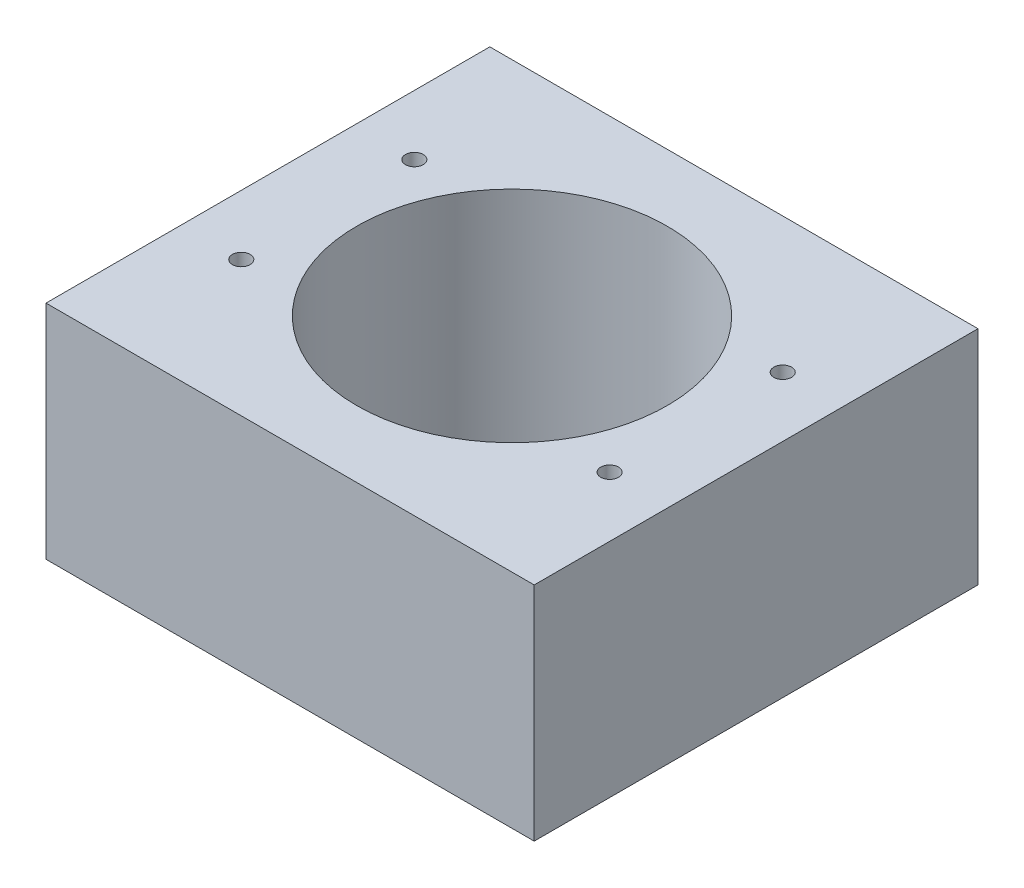
ISO-10303-21;
HEADER;
FILE_DESCRIPTION(('STEP AP214'),'2;1');
FILE_NAME('part.step','',(''),(''),'','','');
FILE_SCHEMA(('AUTOMOTIVE_DESIGN { 1 0 10303 214 1 1 1 1 }'));
ENDSEC;
DATA;
#1=APPLICATION_CONTEXT('core data for automotive mechanical design processes');
#2=APPLICATION_PROTOCOL_DEFINITION('international standard','automotive_design',2000,#1);
#3=PRODUCT_CONTEXT('',#1,'mechanical');
#4=PRODUCT('Part','Part','',(#3));
#5=PRODUCT_RELATED_PRODUCT_CATEGORY('part','',(#4));
#6=PRODUCT_DEFINITION_FORMATION('','',#4);
#7=PRODUCT_DEFINITION_CONTEXT('part definition',#1,'design');
#8=PRODUCT_DEFINITION('design','',#6,#7);
#9=PRODUCT_DEFINITION_SHAPE('','',#8);
#10=(LENGTH_UNIT() NAMED_UNIT(*) SI_UNIT(.MILLI.,.METRE.));
#11=(NAMED_UNIT(*) PLANE_ANGLE_UNIT() SI_UNIT($,.RADIAN.));
#12=(NAMED_UNIT(*) SI_UNIT($,.STERADIAN.) SOLID_ANGLE_UNIT());
#13=UNCERTAINTY_MEASURE_WITH_UNIT(LENGTH_MEASURE(1.E-05),#10,'distance_accuracy_value','');
#14=(GEOMETRIC_REPRESENTATION_CONTEXT(3) GLOBAL_UNCERTAINTY_ASSIGNED_CONTEXT((#13)) GLOBAL_UNIT_ASSIGNED_CONTEXT((#10,
#11,#12)) REPRESENTATION_CONTEXT('',''));
#15=CARTESIAN_POINT('',(0.,0.,0.));
#16=DIRECTION('',(0.,0.,1.));
#17=DIRECTION('',(1.,0.,0.));
#18=AXIS2_PLACEMENT_3D('',#15,#16,#17);
#19=CARTESIAN_POINT('',(55.,50.,-50.));
#20=DIRECTION('',(-1.,0.,0.));
#21=DIRECTION('',(0.,0.,1.));
#22=AXIS2_PLACEMENT_3D('',#19,#20,#21);
#23=PLANE('',#22);
#24=DIRECTION('',(0.,0.,-1.));
#25=VECTOR('',#24,1.);
#26=CARTESIAN_POINT('',(55.,0.,-50.));
#27=LINE('',#26,#25);
#28=CARTESIAN_POINT('',(55.,0.,50.));
#29=VERTEX_POINT('',#28);
#30=CARTESIAN_POINT('',(55.,0.,-50.));
#31=VERTEX_POINT('',#30);
#32=EDGE_CURVE('E96',#29,#31,#27,.T.);
#33=ORIENTED_EDGE('',*,*,#32,.T.);
#34=DIRECTION('',(0.,-1.,0.));
#35=VECTOR('',#34,1.);
#36=CARTESIAN_POINT('',(55.,50.,-50.));
#37=LINE('',#36,#35);
#38=CARTESIAN_POINT('',(55.,50.,-50.));
#39=VERTEX_POINT('',#38);
#40=EDGE_CURVE('E11',#39,#31,#37,.T.);
#41=ORIENTED_EDGE('',*,*,#40,.F.);
#42=DIRECTION('',(0.,0.,-1.));
#43=VECTOR('',#42,1.);
#44=CARTESIAN_POINT('',(55.,50.,-50.));
#45=LINE('',#44,#43);
#46=CARTESIAN_POINT('',(55.,50.,50.));
#47=VERTEX_POINT('',#46);
#48=EDGE_CURVE('E84',#47,#39,#45,.T.);
#49=ORIENTED_EDGE('',*,*,#48,.F.);
#50=DIRECTION('',(0.,-1.,0.));
#51=VECTOR('',#50,1.);
#52=CARTESIAN_POINT('',(55.,50.,50.));
#53=LINE('',#52,#51);
#54=EDGE_CURVE('E92',#47,#29,#53,.T.);
#55=ORIENTED_EDGE('',*,*,#54,.T.);
#56=EDGE_LOOP('',(#33,#41,#49,#55));
#57=FACE_BOUND('',#56,.T.);
#58=ADVANCED_FACE('F33',(#57),#23,.F.);
#59=CARTESIAN_POINT('',(-55.,50.,-50.));
#60=DIRECTION('',(0.,0.,1.));
#61=DIRECTION('',(1.,0.,0.));
#62=AXIS2_PLACEMENT_3D('',#59,#60,#61);
#63=PLANE('',#62);
#64=DIRECTION('',(-1.,0.,0.));
#65=VECTOR('',#64,1.);
#66=CARTESIAN_POINT('',(-55.,0.,-50.));
#67=LINE('',#66,#65);
#68=CARTESIAN_POINT('',(-55.,0.,-50.));
#69=VERTEX_POINT('',#68);
#70=EDGE_CURVE('E88',#31,#69,#67,.T.);
#71=ORIENTED_EDGE('',*,*,#70,.T.);
#72=DIRECTION('',(0.,-1.,0.));
#73=VECTOR('',#72,1.);
#74=CARTESIAN_POINT('',(-55.,50.,-50.));
#75=LINE('',#74,#73);
#76=CARTESIAN_POINT('',(-55.,50.,-50.));
#77=VERTEX_POINT('',#76);
#78=EDGE_CURVE('E41',#77,#69,#75,.T.);
#79=ORIENTED_EDGE('',*,*,#78,.F.);
#80=DIRECTION('',(-1.,0.,0.));
#81=VECTOR('',#80,1.);
#82=CARTESIAN_POINT('',(-55.,50.,-50.));
#83=LINE('',#82,#81);
#84=EDGE_CURVE('E79',#39,#77,#83,.T.);
#85=ORIENTED_EDGE('',*,*,#84,.F.);
#86=ORIENTED_EDGE('',*,*,#40,.T.);
#87=EDGE_LOOP('',(#71,#79,#85,#86));
#88=FACE_BOUND('',#87,.T.);
#89=ADVANCED_FACE('F87',(#88),#63,.F.);
#90=CARTESIAN_POINT('',(-55.,50.,-50.));
#91=DIRECTION('',(1.,0.,0.));
#92=DIRECTION('',(0.,0.,-1.));
#93=AXIS2_PLACEMENT_3D('',#90,#91,#92);
#94=PLANE('',#93);
#95=DIRECTION('',(0.,0.,1.));
#96=VECTOR('',#95,1.);
#97=CARTESIAN_POINT('',(-55.,0.,-50.));
#98=LINE('',#97,#96);
#99=CARTESIAN_POINT('',(-55.,0.,50.));
#100=VERTEX_POINT('',#99);
#101=EDGE_CURVE('E66',#69,#100,#98,.T.);
#102=ORIENTED_EDGE('',*,*,#101,.T.);
#103=DIRECTION('',(0.,-1.,0.));
#104=VECTOR('',#103,1.);
#105=CARTESIAN_POINT('',(-55.,50.,50.));
#106=LINE('',#105,#104);
#107=CARTESIAN_POINT('',(-55.,50.,50.));
#108=VERTEX_POINT('',#107);
#109=EDGE_CURVE('E89',#108,#100,#106,.T.);
#110=ORIENTED_EDGE('',*,*,#109,.F.);
#111=DIRECTION('',(0.,0.,1.));
#112=VECTOR('',#111,1.);
#113=CARTESIAN_POINT('',(-55.,50.,-50.));
#114=LINE('',#113,#112);
#115=EDGE_CURVE('E82',#77,#108,#114,.T.);
#116=ORIENTED_EDGE('',*,*,#115,.F.);
#117=ORIENTED_EDGE('',*,*,#78,.T.);
#118=EDGE_LOOP('',(#102,#110,#116,#117));
#119=FACE_BOUND('',#118,.T.);
#120=ADVANCED_FACE('F90',(#119),#94,.F.);
#121=CARTESIAN_POINT('',(-55.,50.,50.));
#122=DIRECTION('',(0.,0.,-1.));
#123=DIRECTION('',(-1.,0.,0.));
#124=AXIS2_PLACEMENT_3D('',#121,#122,#123);
#125=PLANE('',#124);
#126=DIRECTION('',(1.,0.,0.));
#127=VECTOR('',#126,1.);
#128=CARTESIAN_POINT('',(-55.,0.,50.));
#129=LINE('',#128,#127);
#130=EDGE_CURVE('E72',#100,#29,#129,.T.);
#131=ORIENTED_EDGE('',*,*,#130,.T.);
#132=ORIENTED_EDGE('',*,*,#54,.F.);
#133=DIRECTION('',(1.,0.,0.));
#134=VECTOR('',#133,1.);
#135=CARTESIAN_POINT('',(-55.,50.,50.));
#136=LINE('',#135,#134);
#137=EDGE_CURVE('E49',#108,#47,#136,.T.);
#138=ORIENTED_EDGE('',*,*,#137,.F.);
#139=ORIENTED_EDGE('',*,*,#109,.T.);
#140=EDGE_LOOP('',(#131,#132,#138,#139));
#141=FACE_BOUND('',#140,.T.);
#142=ADVANCED_FACE('F104',(#141),#125,.F.);
#143=CARTESIAN_POINT('',(0.,50.,0.));
#144=DIRECTION('',(0.,1.,0.));
#145=DIRECTION('',(0.,0.,1.));
#146=AXIS2_PLACEMENT_3D('',#143,#144,#145);
#147=PLANE('',#146);
#148=CARTESIAN_POINT('',(-41.5,50.,-19.5));
#149=DIRECTION('',(0.,1.,0.));
#150=DIRECTION('',(0.,0.,-1.));
#151=AXIS2_PLACEMENT_3D('',#148,#149,#150);
#152=CIRCLE('',#151,2.);
#153=CARTESIAN_POINT('',(-41.5,50.,-21.5));
#154=VERTEX_POINT('',#153);
#155=EDGE_CURVE('E131',#154,#154,#152,.T.);
#156=ORIENTED_EDGE('',*,*,#155,.F.);
#157=EDGE_LOOP('',(#156));
#158=FACE_BOUND('',#157,.T.);
#159=CARTESIAN_POINT('',(-41.5,50.,19.5));
#160=DIRECTION('',(0.,-1.,0.));
#161=DIRECTION('',(0.,0.,1.));
#162=AXIS2_PLACEMENT_3D('',#159,#160,#161);
#163=CIRCLE('',#162,2.);
#164=CARTESIAN_POINT('',(-41.5,50.,21.5));
#165=VERTEX_POINT('',#164);
#166=EDGE_CURVE('E125',#165,#165,#163,.T.);
#167=ORIENTED_EDGE('',*,*,#166,.T.);
#168=EDGE_LOOP('',(#167));
#169=FACE_BOUND('',#168,.T.);
#170=CARTESIAN_POINT('',(41.5,50.,-19.5));
#171=DIRECTION('',(0.,-1.,0.));
#172=DIRECTION('',(0.,0.,-1.));
#173=AXIS2_PLACEMENT_3D('',#170,#171,#172);
#174=CIRCLE('',#173,2.);
#175=CARTESIAN_POINT('',(41.5,50.,-21.5));
#176=VERTEX_POINT('',#175);
#177=EDGE_CURVE('E119',#176,#176,#174,.T.);
#178=ORIENTED_EDGE('',*,*,#177,.T.);
#179=EDGE_LOOP('',(#178));
#180=FACE_BOUND('',#179,.T.);
#181=CARTESIAN_POINT('',(41.5,50.,19.5));
#182=DIRECTION('',(0.,1.,0.));
#183=DIRECTION('',(0.,0.,1.));
#184=AXIS2_PLACEMENT_3D('',#181,#182,#183);
#185=CIRCLE('',#184,2.);
#186=CARTESIAN_POINT('',(41.5,50.,21.5));
#187=VERTEX_POINT('',#186);
#188=EDGE_CURVE('E113',#187,#187,#185,.T.);
#189=ORIENTED_EDGE('',*,*,#188,.F.);
#190=EDGE_LOOP('',(#189));
#191=FACE_BOUND('',#190,.T.);
#192=CARTESIAN_POINT('',(0.,50.,0.));
#193=DIRECTION('',(0.,1.,0.));
#194=DIRECTION('',(0.,0.,1.));
#195=AXIS2_PLACEMENT_3D('',#192,#193,#194);
#196=CIRCLE('',#195,35.);
#197=CARTESIAN_POINT('',(0.,50.,35.));
#198=VERTEX_POINT('',#197);
#199=EDGE_CURVE('E99',#198,#198,#196,.T.);
#200=ORIENTED_EDGE('',*,*,#199,.F.);
#201=EDGE_LOOP('',(#200));
#202=FACE_BOUND('',#201,.T.);
#203=ORIENTED_EDGE('',*,*,#48,.T.);
#204=ORIENTED_EDGE('',*,*,#84,.T.);
#205=ORIENTED_EDGE('',*,*,#115,.T.);
#206=ORIENTED_EDGE('',*,*,#137,.T.);
#207=EDGE_LOOP('',(#203,#204,#205,#206));
#208=FACE_BOUND('',#207,.T.);
#209=ADVANCED_FACE('F80',(#158,#169,#180,#191,#202,#208),#147,.T.);
#210=CARTESIAN_POINT('',(0.,0.,0.));
#211=DIRECTION('',(0.,1.,0.));
#212=DIRECTION('',(0.,0.,1.));
#213=AXIS2_PLACEMENT_3D('',#210,#211,#212);
#214=PLANE('',#213);
#215=CARTESIAN_POINT('',(-41.5,0.,-19.5));
#216=DIRECTION('',(0.,1.,0.));
#217=DIRECTION('',(0.,0.,-1.));
#218=AXIS2_PLACEMENT_3D('',#215,#216,#217);
#219=CIRCLE('',#218,2.);
#220=CARTESIAN_POINT('',(-41.5,0.,-21.5));
#221=VERTEX_POINT('',#220);
#222=EDGE_CURVE('E134',#221,#221,#219,.T.);
#223=ORIENTED_EDGE('',*,*,#222,.T.);
#224=EDGE_LOOP('',(#223));
#225=FACE_BOUND('',#224,.T.);
#226=CARTESIAN_POINT('',(-41.5,0.,19.5));
#227=DIRECTION('',(0.,-1.,0.));
#228=DIRECTION('',(0.,0.,1.));
#229=AXIS2_PLACEMENT_3D('',#226,#227,#228);
#230=CIRCLE('',#229,2.);
#231=CARTESIAN_POINT('',(-41.5,0.,21.5));
#232=VERTEX_POINT('',#231);
#233=EDGE_CURVE('E128',#232,#232,#230,.T.);
#234=ORIENTED_EDGE('',*,*,#233,.F.);
#235=EDGE_LOOP('',(#234));
#236=FACE_BOUND('',#235,.T.);
#237=CARTESIAN_POINT('',(41.5,0.,-19.5));
#238=DIRECTION('',(0.,-1.,0.));
#239=DIRECTION('',(0.,0.,-1.));
#240=AXIS2_PLACEMENT_3D('',#237,#238,#239);
#241=CIRCLE('',#240,2.);
#242=CARTESIAN_POINT('',(41.5,0.,-21.5));
#243=VERTEX_POINT('',#242);
#244=EDGE_CURVE('E122',#243,#243,#241,.T.);
#245=ORIENTED_EDGE('',*,*,#244,.F.);
#246=EDGE_LOOP('',(#245));
#247=FACE_BOUND('',#246,.T.);
#248=CARTESIAN_POINT('',(41.5,0.,19.5));
#249=DIRECTION('',(0.,1.,0.));
#250=DIRECTION('',(0.,0.,1.));
#251=AXIS2_PLACEMENT_3D('',#248,#249,#250);
#252=CIRCLE('',#251,2.);
#253=CARTESIAN_POINT('',(41.5,0.,21.5));
#254=VERTEX_POINT('',#253);
#255=EDGE_CURVE('E116',#254,#254,#252,.T.);
#256=ORIENTED_EDGE('',*,*,#255,.T.);
#257=EDGE_LOOP('',(#256));
#258=FACE_BOUND('',#257,.T.);
#259=CARTESIAN_POINT('',(0.,0.,0.));
#260=DIRECTION('',(0.,1.,0.));
#261=DIRECTION('',(0.,0.,1.));
#262=AXIS2_PLACEMENT_3D('',#259,#260,#261);
#263=CIRCLE('',#262,35.);
#264=CARTESIAN_POINT('',(0.,0.,35.));
#265=VERTEX_POINT('',#264);
#266=EDGE_CURVE('E110',#265,#265,#263,.T.);
#267=ORIENTED_EDGE('',*,*,#266,.T.);
#268=EDGE_LOOP('',(#267));
#269=FACE_BOUND('',#268,.T.);
#270=ORIENTED_EDGE('',*,*,#32,.F.);
#271=ORIENTED_EDGE('',*,*,#130,.F.);
#272=ORIENTED_EDGE('',*,*,#101,.F.);
#273=ORIENTED_EDGE('',*,*,#70,.F.);
#274=EDGE_LOOP('',(#270,#271,#272,#273));
#275=FACE_BOUND('',#274,.T.);
#276=ADVANCED_FACE('F107',(#225,#236,#247,#258,#269,#275),#214,.F.);
#277=CARTESIAN_POINT('',(0.,50.,0.));
#278=DIRECTION('',(0.,-1.,0.));
#279=DIRECTION('',(0.,0.,-1.));
#280=AXIS2_PLACEMENT_3D('',#277,#278,#279);
#281=CYLINDRICAL_SURFACE('',#280,35.);
#282=ORIENTED_EDGE('',*,*,#199,.T.);
#283=EDGE_LOOP('',(#282));
#284=FACE_BOUND('',#283,.T.);
#285=ORIENTED_EDGE('',*,*,#266,.F.);
#286=EDGE_LOOP('',(#285));
#287=FACE_BOUND('',#286,.T.);
#288=ADVANCED_FACE('F154',(#284,#287),#281,.F.);
#289=CARTESIAN_POINT('',(41.5,50.,19.5));
#290=DIRECTION('',(0.,-1.,0.));
#291=DIRECTION('',(0.,0.,-1.));
#292=AXIS2_PLACEMENT_3D('',#289,#290,#291);
#293=CYLINDRICAL_SURFACE('',#292,2.);
#294=ORIENTED_EDGE('',*,*,#188,.T.);
#295=EDGE_LOOP('',(#294));
#296=FACE_BOUND('',#295,.T.);
#297=ORIENTED_EDGE('',*,*,#255,.F.);
#298=EDGE_LOOP('',(#297));
#299=FACE_BOUND('',#298,.T.);
#300=ADVANCED_FACE('F157',(#296,#299),#293,.F.);
#301=CARTESIAN_POINT('',(41.5,50.,-19.5));
#302=DIRECTION('',(0.,-1.,0.));
#303=DIRECTION('',(0.,0.,-1.));
#304=AXIS2_PLACEMENT_3D('',#301,#302,#303);
#305=CYLINDRICAL_SURFACE('',#304,2.);
#306=ORIENTED_EDGE('',*,*,#177,.F.);
#307=EDGE_LOOP('',(#306));
#308=FACE_BOUND('',#307,.T.);
#309=ORIENTED_EDGE('',*,*,#244,.T.);
#310=EDGE_LOOP('',(#309));
#311=FACE_BOUND('',#310,.T.);
#312=ADVANCED_FACE('F211',(#308,#311),#305,.F.);
#313=CARTESIAN_POINT('',(-41.5,50.,19.5));
#314=DIRECTION('',(0.,-1.,0.));
#315=DIRECTION('',(0.,0.,-1.));
#316=AXIS2_PLACEMENT_3D('',#313,#314,#315);
#317=CYLINDRICAL_SURFACE('',#316,2.);
#318=ORIENTED_EDGE('',*,*,#166,.F.);
#319=EDGE_LOOP('',(#318));
#320=FACE_BOUND('',#319,.T.);
#321=ORIENTED_EDGE('',*,*,#233,.T.);
#322=EDGE_LOOP('',(#321));
#323=FACE_BOUND('',#322,.T.);
#324=ADVANCED_FACE('F192',(#320,#323),#317,.F.);
#325=CARTESIAN_POINT('',(-41.5,50.,-19.5));
#326=DIRECTION('',(0.,-1.,0.));
#327=DIRECTION('',(0.,0.,-1.));
#328=AXIS2_PLACEMENT_3D('',#325,#326,#327);
#329=CYLINDRICAL_SURFACE('',#328,2.);
#330=ORIENTED_EDGE('',*,*,#155,.T.);
#331=EDGE_LOOP('',(#330));
#332=FACE_BOUND('',#331,.T.);
#333=ORIENTED_EDGE('',*,*,#222,.F.);
#334=EDGE_LOOP('',(#333));
#335=FACE_BOUND('',#334,.T.);
#336=ADVANCED_FACE('F140',(#332,#335),#329,.F.);
#337=CLOSED_SHELL('',(#58,#89,#120,#142,#209,#276,#288,#300,#312,#324,#336));
#338=MANIFOLD_SOLID_BREP('B2',#337);
#339=ADVANCED_BREP_SHAPE_REPRESENTATION('',(#18,#338),#14);
#340=SHAPE_DEFINITION_REPRESENTATION(#9,#339);
ENDSEC;
END-ISO-10303-21;
